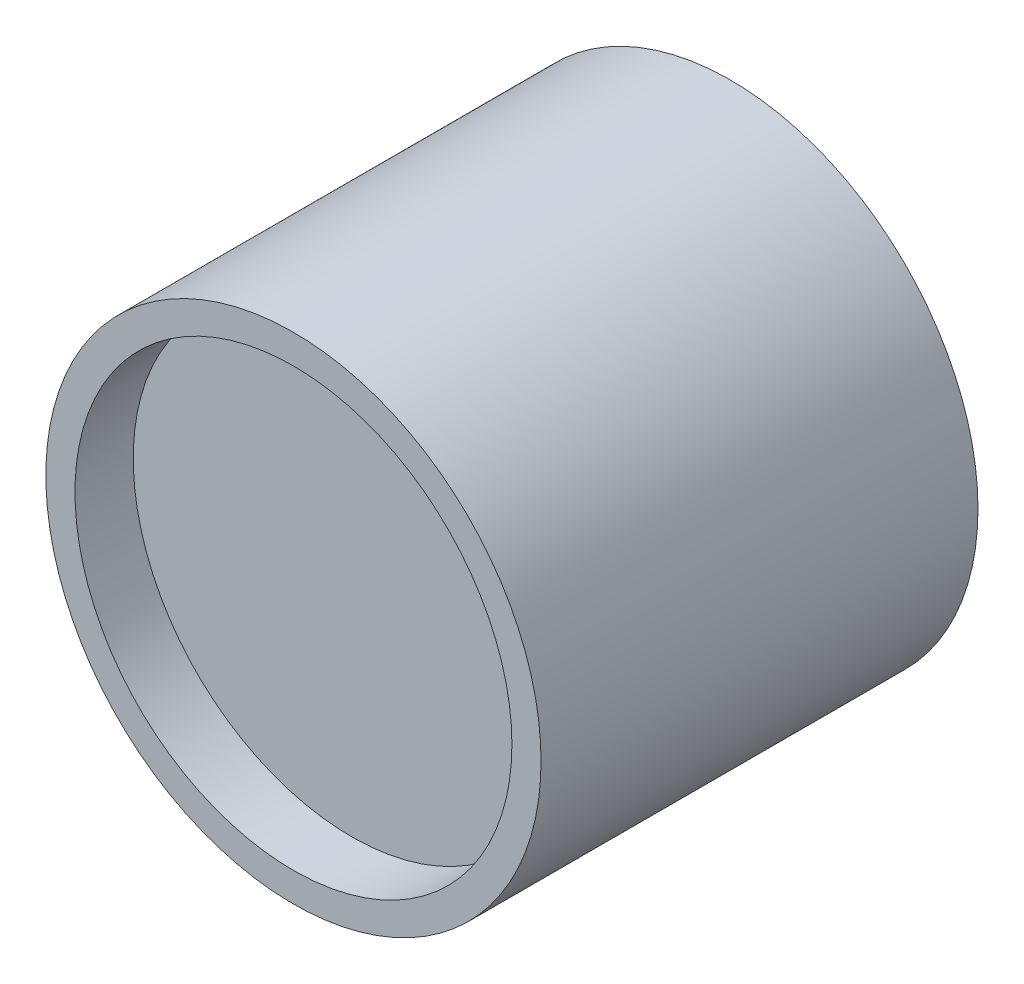
ISO-10303-21;
HEADER;
FILE_DESCRIPTION(('STEP AP214'),'2;1');
FILE_NAME('part.step','',(''),(''),'','','');
FILE_SCHEMA(('AUTOMOTIVE_DESIGN { 1 0 10303 214 1 1 1 1 }'));
ENDSEC;
DATA;
#1=APPLICATION_CONTEXT('core data for automotive mechanical design processes');
#2=APPLICATION_PROTOCOL_DEFINITION('international standard','automotive_design',2000,#1);
#3=PRODUCT_CONTEXT('',#1,'mechanical');
#4=PRODUCT('Part','Part','',(#3));
#5=PRODUCT_RELATED_PRODUCT_CATEGORY('part','',(#4));
#6=PRODUCT_DEFINITION_FORMATION('','',#4);
#7=PRODUCT_DEFINITION_CONTEXT('part definition',#1,'design');
#8=PRODUCT_DEFINITION('design','',#6,#7);
#9=PRODUCT_DEFINITION_SHAPE('','',#8);
#10=(LENGTH_UNIT() NAMED_UNIT(*) SI_UNIT(.MILLI.,.METRE.));
#11=(NAMED_UNIT(*) PLANE_ANGLE_UNIT() SI_UNIT($,.RADIAN.));
#12=(NAMED_UNIT(*) SI_UNIT($,.STERADIAN.) SOLID_ANGLE_UNIT());
#13=UNCERTAINTY_MEASURE_WITH_UNIT(LENGTH_MEASURE(1.E-05),#10,'distance_accuracy_value','');
#14=(GEOMETRIC_REPRESENTATION_CONTEXT(3) GLOBAL_UNCERTAINTY_ASSIGNED_CONTEXT((#13)) GLOBAL_UNIT_ASSIGNED_CONTEXT((#10,
#11,#12)) REPRESENTATION_CONTEXT('',''));
#15=CARTESIAN_POINT('',(0.,0.,0.));
#16=DIRECTION('',(0.,0.,1.));
#17=DIRECTION('',(1.,0.,0.));
#18=AXIS2_PLACEMENT_3D('',#15,#16,#17);
#19=CARTESIAN_POINT('',(0.,0.,75.));
#20=DIRECTION('',(0.,0.,-1.));
#21=DIRECTION('',(-1.,0.,0.));
#22=AXIS2_PLACEMENT_3D('',#19,#20,#21);
#23=CYLINDRICAL_SURFACE('',#22,42.5);
#24=CARTESIAN_POINT('',(0.,0.,75.));
#25=DIRECTION('',(0.,0.,1.));
#26=DIRECTION('',(1.,0.,0.));
#27=AXIS2_PLACEMENT_3D('',#24,#25,#26);
#28=CIRCLE('',#27,42.5);
#29=CARTESIAN_POINT('',(42.5,0.,75.));
#30=VERTEX_POINT('',#29);
#31=EDGE_CURVE('E10',#30,#30,#28,.T.);
#32=ORIENTED_EDGE('',*,*,#31,.F.);
#33=EDGE_LOOP('',(#32));
#34=FACE_BOUND('',#33,.T.);
#35=CARTESIAN_POINT('',(0.,0.,0.));
#36=DIRECTION('',(0.,0.,1.));
#37=DIRECTION('',(1.,0.,0.));
#38=AXIS2_PLACEMENT_3D('',#35,#36,#37);
#39=CIRCLE('',#38,42.5);
#40=CARTESIAN_POINT('',(42.5,0.,0.));
#41=VERTEX_POINT('',#40);
#42=EDGE_CURVE('E41',#41,#41,#39,.T.);
#43=ORIENTED_EDGE('',*,*,#42,.T.);
#44=EDGE_LOOP('',(#43));
#45=FACE_BOUND('',#44,.T.);
#46=ADVANCED_FACE('F38',(#34,#45),#23,.T.);
#47=CARTESIAN_POINT('',(0.,0.,75.));
#48=DIRECTION('',(0.,0.,1.));
#49=DIRECTION('',(1.,0.,0.));
#50=AXIS2_PLACEMENT_3D('',#47,#48,#49);
#51=PLANE('',#50);
#52=CARTESIAN_POINT('',(0.,0.,75.));
#53=DIRECTION('',(0.,0.,1.));
#54=DIRECTION('',(1.,0.,0.));
#55=AXIS2_PLACEMENT_3D('',#52,#53,#54);
#56=CIRCLE('',#55,37.5);
#57=CARTESIAN_POINT('',(37.5,0.,75.));
#58=VERTEX_POINT('',#57);
#59=EDGE_CURVE('E50',#58,#58,#56,.T.);
#60=ORIENTED_EDGE('',*,*,#59,.F.);
#61=EDGE_LOOP('',(#60));
#62=FACE_BOUND('',#61,.T.);
#63=ORIENTED_EDGE('',*,*,#31,.T.);
#64=EDGE_LOOP('',(#63));
#65=FACE_BOUND('',#64,.T.);
#66=ADVANCED_FACE('F75',(#62,#65),#51,.T.);
#67=CARTESIAN_POINT('',(0.,0.,0.));
#68=DIRECTION('',(0.,0.,1.));
#69=DIRECTION('',(1.,0.,0.));
#70=AXIS2_PLACEMENT_3D('',#67,#68,#69);
#71=PLANE('',#70);
#72=CARTESIAN_POINT('',(0.,0.,0.));
#73=DIRECTION('',(0.,0.,-1.));
#74=DIRECTION('',(-1.,0.,0.));
#75=AXIS2_PLACEMENT_3D('',#72,#73,#74);
#76=CIRCLE('',#75,37.5);
#77=CARTESIAN_POINT('',(-37.5,0.,0.));
#78=VERTEX_POINT('',#77);
#79=EDGE_CURVE('E56',#78,#78,#76,.T.);
#80=ORIENTED_EDGE('',*,*,#79,.F.);
#81=EDGE_LOOP('',(#80));
#82=FACE_BOUND('',#81,.T.);
#83=ORIENTED_EDGE('',*,*,#42,.F.);
#84=EDGE_LOOP('',(#83));
#85=FACE_BOUND('',#84,.T.);
#86=ADVANCED_FACE('F71',(#82,#85),#71,.F.);
#87=CARTESIAN_POINT('',(0.,0.,65.));
#88=DIRECTION('',(0.,0.,1.));
#89=DIRECTION('',(1.,0.,0.));
#90=AXIS2_PLACEMENT_3D('',#87,#88,#89);
#91=CYLINDRICAL_SURFACE('',#90,37.5);
#92=CARTESIAN_POINT('',(0.,0.,65.));
#93=DIRECTION('',(0.,0.,1.));
#94=DIRECTION('',(1.,0.,0.));
#95=AXIS2_PLACEMENT_3D('',#92,#93,#94);
#96=CIRCLE('',#95,37.5);
#97=CARTESIAN_POINT('',(37.5,0.,65.));
#98=VERTEX_POINT('',#97);
#99=EDGE_CURVE('E48',#98,#98,#96,.T.);
#100=ORIENTED_EDGE('',*,*,#99,.F.);
#101=EDGE_LOOP('',(#100));
#102=FACE_BOUND('',#101,.T.);
#103=ORIENTED_EDGE('',*,*,#59,.T.);
#104=EDGE_LOOP('',(#103));
#105=FACE_BOUND('',#104,.T.);
#106=ADVANCED_FACE('F74',(#102,#105),#91,.F.);
#107=CARTESIAN_POINT('',(0.,0.,65.));
#108=DIRECTION('',(0.,0.,1.));
#109=DIRECTION('',(1.,0.,0.));
#110=AXIS2_PLACEMENT_3D('',#107,#108,#109);
#111=PLANE('',#110);
#112=ORIENTED_EDGE('',*,*,#99,.T.);
#113=EDGE_LOOP('',(#112));
#114=FACE_BOUND('',#113,.T.);
#115=ADVANCED_FACE('F67',(#114),#111,.T.);
#116=CARTESIAN_POINT('',(0.,0.,10.));
#117=DIRECTION('',(0.,0.,-1.));
#118=DIRECTION('',(-1.,0.,0.));
#119=AXIS2_PLACEMENT_3D('',#116,#117,#118);
#120=CYLINDRICAL_SURFACE('',#119,37.5);
#121=CARTESIAN_POINT('',(0.,0.,10.));
#122=DIRECTION('',(0.,0.,-1.));
#123=DIRECTION('',(-1.,0.,0.));
#124=AXIS2_PLACEMENT_3D('',#121,#122,#123);
#125=CIRCLE('',#124,37.5);
#126=CARTESIAN_POINT('',(-37.5,0.,10.));
#127=VERTEX_POINT('',#126);
#128=EDGE_CURVE('E53',#127,#127,#125,.T.);
#129=ORIENTED_EDGE('',*,*,#128,.F.);
#130=EDGE_LOOP('',(#129));
#131=FACE_BOUND('',#130,.T.);
#132=ORIENTED_EDGE('',*,*,#79,.T.);
#133=EDGE_LOOP('',(#132));
#134=FACE_BOUND('',#133,.T.);
#135=ADVANCED_FACE('F64',(#131,#134),#120,.F.);
#136=CARTESIAN_POINT('',(0.,0.,10.));
#137=DIRECTION('',(0.,0.,-1.));
#138=DIRECTION('',(-1.,0.,0.));
#139=AXIS2_PLACEMENT_3D('',#136,#137,#138);
#140=PLANE('',#139);
#141=ORIENTED_EDGE('',*,*,#128,.T.);
#142=EDGE_LOOP('',(#141));
#143=FACE_BOUND('',#142,.T.);
#144=ADVANCED_FACE('F62',(#143),#140,.T.);
#145=CLOSED_SHELL('',(#46,#66,#86,#106,#115,#135,#144));
#146=MANIFOLD_SOLID_BREP('B2',#145);
#147=ADVANCED_BREP_SHAPE_REPRESENTATION('',(#18,#146),#14);
#148=SHAPE_DEFINITION_REPRESENTATION(#9,#147);
ENDSEC;
END-ISO-10303-21;
